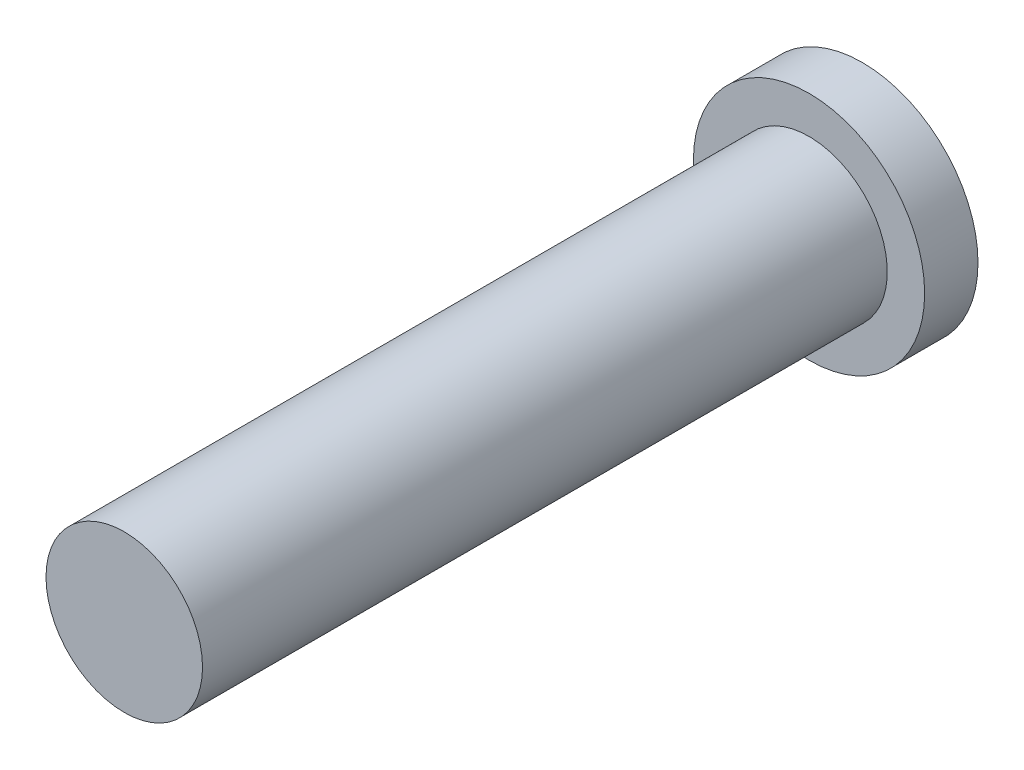
ISO-10303-21;
HEADER;
FILE_DESCRIPTION(('STEP AP214'),'2;1');
FILE_NAME('part.step','',(''),(''),'','','');
FILE_SCHEMA(('AUTOMOTIVE_DESIGN { 1 0 10303 214 1 1 1 1 }'));
ENDSEC;
DATA;
#1=APPLICATION_CONTEXT('core data for automotive mechanical design processes');
#2=APPLICATION_PROTOCOL_DEFINITION('international standard','automotive_design',2000,#1);
#3=PRODUCT_CONTEXT('',#1,'mechanical');
#4=PRODUCT('Part','Part','',(#3));
#5=PRODUCT_RELATED_PRODUCT_CATEGORY('part','',(#4));
#6=PRODUCT_DEFINITION_FORMATION('','',#4);
#7=PRODUCT_DEFINITION_CONTEXT('part definition',#1,'design');
#8=PRODUCT_DEFINITION('design','',#6,#7);
#9=PRODUCT_DEFINITION_SHAPE('','',#8);
#10=(LENGTH_UNIT() NAMED_UNIT(*) SI_UNIT(.MILLI.,.METRE.));
#11=(NAMED_UNIT(*) PLANE_ANGLE_UNIT() SI_UNIT($,.RADIAN.));
#12=(NAMED_UNIT(*) SI_UNIT($,.STERADIAN.) SOLID_ANGLE_UNIT());
#13=UNCERTAINTY_MEASURE_WITH_UNIT(LENGTH_MEASURE(1.E-05),#10,'distance_accuracy_value','');
#14=(GEOMETRIC_REPRESENTATION_CONTEXT(3) GLOBAL_UNCERTAINTY_ASSIGNED_CONTEXT((#13)) GLOBAL_UNIT_ASSIGNED_CONTEXT((#10,
#11,#12)) REPRESENTATION_CONTEXT('',''));
#15=CARTESIAN_POINT('',(0.,0.,0.));
#16=DIRECTION('',(0.,0.,1.));
#17=DIRECTION('',(1.,0.,0.));
#18=AXIS2_PLACEMENT_3D('',#15,#16,#17);
#19=CARTESIAN_POINT('',(0.,0.,41.5));
#20=DIRECTION('',(0.,0.,-1.));
#21=DIRECTION('',(-1.,0.,0.));
#22=AXIS2_PLACEMENT_3D('',#19,#20,#21);
#23=CYLINDRICAL_SURFACE('',#22,4.4);
#24=CARTESIAN_POINT('',(0.,0.,41.5));
#25=DIRECTION('',(0.,0.,1.));
#26=DIRECTION('',(1.,0.,0.));
#27=AXIS2_PLACEMENT_3D('',#24,#25,#26);
#28=CIRCLE('',#27,4.4);
#29=CARTESIAN_POINT('',(4.4,0.,41.5));
#30=VERTEX_POINT('',#29);
#31=EDGE_CURVE('E48',#30,#30,#28,.T.);
#32=ORIENTED_EDGE('',*,*,#31,.F.);
#33=EDGE_LOOP('',(#32));
#34=FACE_BOUND('',#33,.T.);
#35=CARTESIAN_POINT('',(0.,0.,3.));
#36=DIRECTION('',(0.,0.,-1.));
#37=DIRECTION('',(-1.,0.,0.));
#38=AXIS2_PLACEMENT_3D('',#35,#36,#37);
#39=CIRCLE('',#38,4.4);
#40=CARTESIAN_POINT('',(-4.4,0.,3.));
#41=VERTEX_POINT('',#40);
#42=EDGE_CURVE('E10',#41,#41,#39,.T.);
#43=ORIENTED_EDGE('',*,*,#42,.F.);
#44=EDGE_LOOP('',(#43));
#45=FACE_BOUND('',#44,.T.);
#46=ADVANCED_FACE('F41',(#34,#45),#23,.T.);
#47=CARTESIAN_POINT('',(0.,0.,41.5));
#48=DIRECTION('',(0.,0.,1.));
#49=DIRECTION('',(1.,0.,0.));
#50=AXIS2_PLACEMENT_3D('',#47,#48,#49);
#51=PLANE('',#50);
#52=ORIENTED_EDGE('',*,*,#31,.T.);
#53=EDGE_LOOP('',(#52));
#54=FACE_BOUND('',#53,.T.);
#55=ADVANCED_FACE('F70',(#54),#51,.T.);
#56=CARTESIAN_POINT('',(0.,0.,3.));
#57=DIRECTION('',(0.,0.,-1.));
#58=DIRECTION('',(-1.,0.,0.));
#59=AXIS2_PLACEMENT_3D('',#56,#57,#58);
#60=CYLINDRICAL_SURFACE('',#59,6.5);
#61=CARTESIAN_POINT('',(0.,0.,3.));
#62=DIRECTION('',(0.,0.,-1.));
#63=DIRECTION('',(-1.,0.,0.));
#64=AXIS2_PLACEMENT_3D('',#61,#62,#63);
#65=CIRCLE('',#64,6.5);
#66=CARTESIAN_POINT('',(-6.5,0.,3.));
#67=VERTEX_POINT('',#66);
#68=EDGE_CURVE('E53',#67,#67,#65,.T.);
#69=ORIENTED_EDGE('',*,*,#68,.T.);
#70=EDGE_LOOP('',(#69));
#71=FACE_BOUND('',#70,.T.);
#72=CARTESIAN_POINT('',(0.,0.,0.));
#73=DIRECTION('',(0.,0.,-1.));
#74=DIRECTION('',(-1.,0.,0.));
#75=AXIS2_PLACEMENT_3D('',#72,#73,#74);
#76=CIRCLE('',#75,6.5);
#77=CARTESIAN_POINT('',(-6.5,0.,0.));
#78=VERTEX_POINT('',#77);
#79=EDGE_CURVE('E58',#78,#78,#76,.T.);
#80=ORIENTED_EDGE('',*,*,#79,.F.);
#81=EDGE_LOOP('',(#80));
#82=FACE_BOUND('',#81,.T.);
#83=ADVANCED_FACE('F67',(#71,#82),#60,.T.);
#84=CARTESIAN_POINT('',(0.,0.,3.));
#85=DIRECTION('',(0.,0.,-1.));
#86=DIRECTION('',(-1.,0.,0.));
#87=AXIS2_PLACEMENT_3D('',#84,#85,#86);
#88=PLANE('',#87);
#89=ORIENTED_EDGE('',*,*,#42,.T.);
#90=EDGE_LOOP('',(#89));
#91=FACE_BOUND('',#90,.T.);
#92=ORIENTED_EDGE('',*,*,#68,.F.);
#93=EDGE_LOOP('',(#92));
#94=FACE_BOUND('',#93,.T.);
#95=ADVANCED_FACE('F69',(#91,#94),#88,.F.);
#96=CARTESIAN_POINT('',(0.,0.,0.));
#97=DIRECTION('',(0.,0.,1.));
#98=DIRECTION('',(1.,0.,0.));
#99=AXIS2_PLACEMENT_3D('',#96,#97,#98);
#100=PLANE('',#99);
#101=ORIENTED_EDGE('',*,*,#79,.T.);
#102=EDGE_LOOP('',(#101));
#103=FACE_BOUND('',#102,.T.);
#104=ADVANCED_FACE('F65',(#103),#100,.F.);
#105=CLOSED_SHELL('',(#46,#55,#83,#95,#104));
#106=MANIFOLD_SOLID_BREP('B2',#105);
#107=ADVANCED_BREP_SHAPE_REPRESENTATION('',(#18,#106),#14);
#108=SHAPE_DEFINITION_REPRESENTATION(#9,#107);
ENDSEC;
END-ISO-10303-21;
